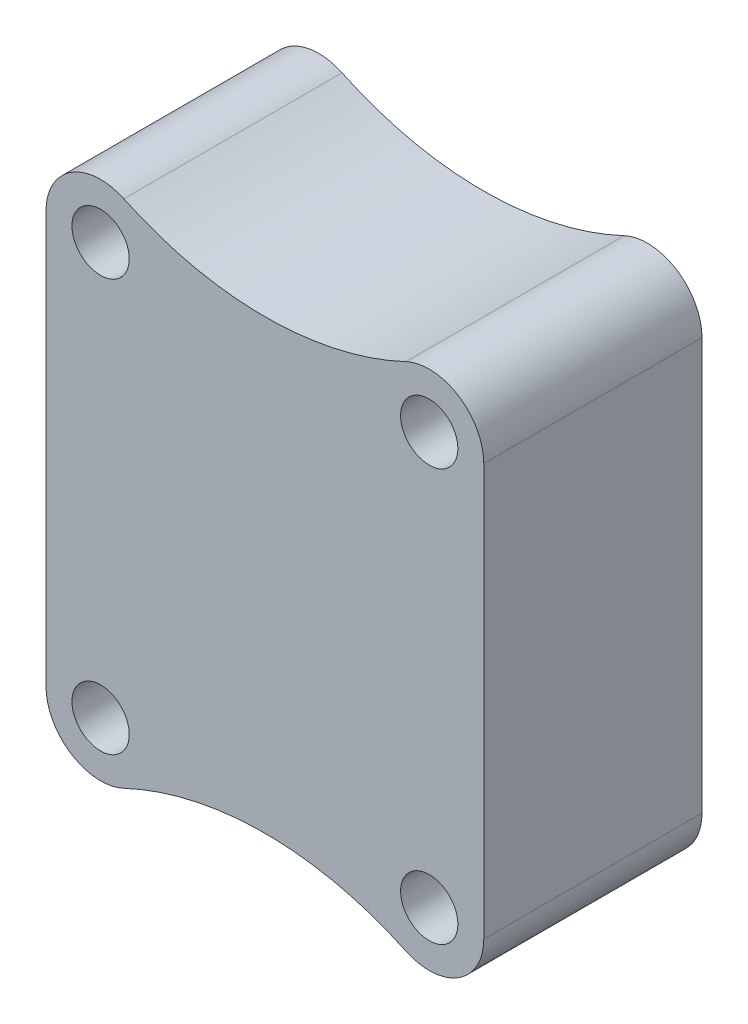
ISO-10303-21;
HEADER;
FILE_DESCRIPTION(('STEP AP214'),'2;1');
FILE_NAME('part.step','',(''),(''),'','','');
FILE_SCHEMA(('AUTOMOTIVE_DESIGN { 1 0 10303 214 1 1 1 1 }'));
ENDSEC;
DATA;
#1=APPLICATION_CONTEXT('core data for automotive mechanical design processes');
#2=APPLICATION_PROTOCOL_DEFINITION('international standard','automotive_design',2000,#1);
#3=PRODUCT_CONTEXT('',#1,'mechanical');
#4=PRODUCT('Part','Part','',(#3));
#5=PRODUCT_RELATED_PRODUCT_CATEGORY('part','',(#4));
#6=PRODUCT_DEFINITION_FORMATION('','',#4);
#7=PRODUCT_DEFINITION_CONTEXT('part definition',#1,'design');
#8=PRODUCT_DEFINITION('design','',#6,#7);
#9=PRODUCT_DEFINITION_SHAPE('','',#8);
#10=(LENGTH_UNIT() NAMED_UNIT(*) SI_UNIT(.MILLI.,.METRE.));
#11=(NAMED_UNIT(*) PLANE_ANGLE_UNIT() SI_UNIT($,.RADIAN.));
#12=(NAMED_UNIT(*) SI_UNIT($,.STERADIAN.) SOLID_ANGLE_UNIT());
#13=UNCERTAINTY_MEASURE_WITH_UNIT(LENGTH_MEASURE(1.E-05),#10,'distance_accuracy_value','');
#14=(GEOMETRIC_REPRESENTATION_CONTEXT(3) GLOBAL_UNCERTAINTY_ASSIGNED_CONTEXT((#13)) GLOBAL_UNIT_ASSIGNED_CONTEXT((#10,
#11,#12)) REPRESENTATION_CONTEXT('',''));
#15=CARTESIAN_POINT('',(0.,0.,0.));
#16=DIRECTION('',(0.,0.,1.));
#17=DIRECTION('',(1.,0.,0.));
#18=AXIS2_PLACEMENT_3D('',#15,#16,#17);
#19=CARTESIAN_POINT('',(12.05,-25.5393518518518,16.));
#20=DIRECTION('',(0.,0.,1.));
#21=DIRECTION('',(1.,0.,0.));
#22=AXIS2_PLACEMENT_3D('',#19,#20,#21);
#23=PLANE('',#22);
#24=CARTESIAN_POINT('',(24.1,30.2,16.));
#25=DIRECTION('',(0.,0.,1.));
#26=DIRECTION('',(1.,0.,0.));
#27=AXIS2_PLACEMENT_3D('',#24,#25,#26);
#28=CIRCLE('',#27,2.1);
#29=CARTESIAN_POINT('',(26.2,30.2,16.));
#30=VERTEX_POINT('',#29);
#31=EDGE_CURVE('E229',#30,#30,#28,.T.);
#32=ORIENTED_EDGE('',*,*,#31,.F.);
#33=EDGE_LOOP('',(#32));
#34=FACE_BOUND('',#33,.T.);
#35=CARTESIAN_POINT('',(0.,0.,16.));
#36=DIRECTION('',(0.,0.,1.));
#37=DIRECTION('',(1.,0.,0.));
#38=AXIS2_PLACEMENT_3D('',#35,#36,#37);
#39=CIRCLE('',#38,2.1);
#40=CARTESIAN_POINT('',(2.1,0.,16.));
#41=VERTEX_POINT('',#40);
#42=EDGE_CURVE('E154',#41,#41,#39,.T.);
#43=ORIENTED_EDGE('',*,*,#42,.F.);
#44=EDGE_LOOP('',(#43));
#45=FACE_BOUND('',#44,.T.);
#46=CARTESIAN_POINT('',(12.05,-25.5393518518518,16.));
#47=DIRECTION('',(0.,0.,-1.));
#48=DIRECTION('',(1.,0.,0.));
#49=AXIS2_PLACEMENT_3D('',#46,#47,#48);
#50=CIRCLE('',#49,24.2393518518518);
#51=CARTESIAN_POINT('',(1.70683804121514,-3.61755496171943,16.));
#52=VERTEX_POINT('',#51);
#53=CARTESIAN_POINT('',(22.3931619587849,-3.61755496171943,16.));
#54=VERTEX_POINT('',#53);
#55=EDGE_CURVE('E172',#52,#54,#50,.T.);
#56=ORIENTED_EDGE('',*,*,#55,.T.);
#57=CARTESIAN_POINT('',(24.1,0.,16.));
#58=DIRECTION('',(0.,0.,1.));
#59=DIRECTION('',(1.,0.,0.));
#60=AXIS2_PLACEMENT_3D('',#57,#58,#59);
#61=CIRCLE('',#60,4.);
#62=CARTESIAN_POINT('',(28.1,0.,16.));
#63=VERTEX_POINT('',#62);
#64=EDGE_CURVE('E108',#54,#63,#61,.T.);
#65=ORIENTED_EDGE('',*,*,#64,.T.);
#66=DIRECTION('',(0.,1.,0.));
#67=VECTOR('',#66,1.);
#68=CARTESIAN_POINT('',(28.1,0.,16.));
#69=LINE('',#68,#67);
#70=CARTESIAN_POINT('',(28.1,30.2,16.));
#71=VERTEX_POINT('',#70);
#72=EDGE_CURVE('E193',#63,#71,#69,.T.);
#73=ORIENTED_EDGE('',*,*,#72,.T.);
#74=CARTESIAN_POINT('',(24.1,30.2,16.));
#75=DIRECTION('',(0.,0.,1.));
#76=DIRECTION('',(-1.,0.,0.));
#77=AXIS2_PLACEMENT_3D('',#74,#75,#76);
#78=CIRCLE('',#77,4.00000000000001);
#79=CARTESIAN_POINT('',(22.3931619587849,33.8175549617194,16.));
#80=VERTEX_POINT('',#79);
#81=EDGE_CURVE('E207',#71,#80,#78,.T.);
#82=ORIENTED_EDGE('',*,*,#81,.T.);
#83=CARTESIAN_POINT('',(12.05,55.7393518518518,16.));
#84=DIRECTION('',(0.,0.,-1.));
#85=DIRECTION('',(-1.,0.,0.));
#86=AXIS2_PLACEMENT_3D('',#83,#84,#85);
#87=CIRCLE('',#86,24.2393518518518);
#88=CARTESIAN_POINT('',(1.70683804121514,33.8175549617194,16.));
#89=VERTEX_POINT('',#88);
#90=EDGE_CURVE('E127',#80,#89,#87,.T.);
#91=ORIENTED_EDGE('',*,*,#90,.T.);
#92=CARTESIAN_POINT('',(0.,30.2,16.));
#93=DIRECTION('',(0.,0.,1.));
#94=DIRECTION('',(-1.,0.,0.));
#95=AXIS2_PLACEMENT_3D('',#92,#93,#94);
#96=CIRCLE('',#95,4.);
#97=CARTESIAN_POINT('',(-4.,30.2,16.));
#98=VERTEX_POINT('',#97);
#99=EDGE_CURVE('E121',#89,#98,#96,.T.);
#100=ORIENTED_EDGE('',*,*,#99,.T.);
#101=DIRECTION('',(0.,-1.,0.));
#102=VECTOR('',#101,1.);
#103=CARTESIAN_POINT('',(-4.,0.,16.));
#104=LINE('',#103,#102);
#105=CARTESIAN_POINT('',(-4.,0.,16.));
#106=VERTEX_POINT('',#105);
#107=EDGE_CURVE('E125',#98,#106,#104,.T.);
#108=ORIENTED_EDGE('',*,*,#107,.T.);
#109=CARTESIAN_POINT('',(0.,0.,16.));
#110=DIRECTION('',(0.,0.,1.));
#111=DIRECTION('',(-1.,0.,0.));
#112=AXIS2_PLACEMENT_3D('',#109,#110,#111);
#113=CIRCLE('',#112,4.);
#114=EDGE_CURVE('E65',#106,#52,#113,.T.);
#115=ORIENTED_EDGE('',*,*,#114,.T.);
#116=EDGE_LOOP('',(#56,#65,#73,#82,#91,#100,#108,#115));
#117=FACE_BOUND('',#116,.T.);
#118=CARTESIAN_POINT('',(0.,30.2,16.));
#119=DIRECTION('',(0.,0.,1.));
#120=DIRECTION('',(1.,0.,0.));
#121=AXIS2_PLACEMENT_3D('',#118,#119,#120);
#122=CIRCLE('',#121,2.1);
#123=CARTESIAN_POINT('',(2.1,30.2,16.));
#124=VERTEX_POINT('',#123);
#125=EDGE_CURVE('E221',#124,#124,#122,.T.);
#126=ORIENTED_EDGE('',*,*,#125,.F.);
#127=EDGE_LOOP('',(#126));
#128=FACE_BOUND('',#127,.T.);
#129=CARTESIAN_POINT('',(24.1,0.,16.));
#130=DIRECTION('',(0.,0.,1.));
#131=DIRECTION('',(1.,0.,0.));
#132=AXIS2_PLACEMENT_3D('',#129,#130,#131);
#133=CIRCLE('',#132,2.1);
#134=CARTESIAN_POINT('',(26.2,0.,16.));
#135=VERTEX_POINT('',#134);
#136=EDGE_CURVE('E237',#135,#135,#133,.T.);
#137=ORIENTED_EDGE('',*,*,#136,.F.);
#138=EDGE_LOOP('',(#137));
#139=FACE_BOUND('',#138,.T.);
#140=ADVANCED_FACE('F47',(#34,#45,#117,#128,#139),#23,.T.);
#141=CARTESIAN_POINT('',(12.05,-25.5393518518518,0.));
#142=DIRECTION('',(0.,0.,1.));
#143=DIRECTION('',(1.,0.,0.));
#144=AXIS2_PLACEMENT_3D('',#141,#142,#143);
#145=PLANE('',#144);
#146=CARTESIAN_POINT('',(12.05,-25.5393518518518,0.));
#147=DIRECTION('',(0.,0.,-1.));
#148=DIRECTION('',(1.,0.,0.));
#149=AXIS2_PLACEMENT_3D('',#146,#147,#148);
#150=CIRCLE('',#149,24.2393518518518);
#151=CARTESIAN_POINT('',(1.70683804121514,-3.61755496171943,0.));
#152=VERTEX_POINT('',#151);
#153=CARTESIAN_POINT('',(22.3931619587849,-3.61755496171943,0.));
#154=VERTEX_POINT('',#153);
#155=EDGE_CURVE('E149',#152,#154,#150,.T.);
#156=ORIENTED_EDGE('',*,*,#155,.F.);
#157=CARTESIAN_POINT('',(0.,0.,0.));
#158=DIRECTION('',(0.,0.,1.));
#159=DIRECTION('',(-1.,0.,0.));
#160=AXIS2_PLACEMENT_3D('',#157,#158,#159);
#161=CIRCLE('',#160,4.);
#162=CARTESIAN_POINT('',(-4.,0.,0.));
#163=VERTEX_POINT('',#162);
#164=EDGE_CURVE('E100',#163,#152,#161,.T.);
#165=ORIENTED_EDGE('',*,*,#164,.F.);
#166=DIRECTION('',(0.,-1.,0.));
#167=VECTOR('',#166,1.);
#168=CARTESIAN_POINT('',(-4.,0.,0.));
#169=LINE('',#168,#167);
#170=CARTESIAN_POINT('',(-4.,30.2,0.));
#171=VERTEX_POINT('',#170);
#172=EDGE_CURVE('E94',#171,#163,#169,.T.);
#173=ORIENTED_EDGE('',*,*,#172,.F.);
#174=CARTESIAN_POINT('',(0.,30.2,0.));
#175=DIRECTION('',(0.,0.,1.));
#176=DIRECTION('',(-1.,0.,0.));
#177=AXIS2_PLACEMENT_3D('',#174,#175,#176);
#178=CIRCLE('',#177,4.);
#179=CARTESIAN_POINT('',(1.70683804121514,33.8175549617194,0.));
#180=VERTEX_POINT('',#179);
#181=EDGE_CURVE('E136',#180,#171,#178,.T.);
#182=ORIENTED_EDGE('',*,*,#181,.F.);
#183=CARTESIAN_POINT('',(12.05,55.7393518518518,0.));
#184=DIRECTION('',(0.,0.,-1.));
#185=DIRECTION('',(-1.,0.,0.));
#186=AXIS2_PLACEMENT_3D('',#183,#184,#185);
#187=CIRCLE('',#186,24.2393518518518);
#188=CARTESIAN_POINT('',(22.3931619587849,33.8175549617194,0.));
#189=VERTEX_POINT('',#188);
#190=EDGE_CURVE('E163',#189,#180,#187,.T.);
#191=ORIENTED_EDGE('',*,*,#190,.F.);
#192=CARTESIAN_POINT('',(24.1,30.2,0.));
#193=DIRECTION('',(0.,0.,1.));
#194=DIRECTION('',(-1.,0.,0.));
#195=AXIS2_PLACEMENT_3D('',#192,#193,#194);
#196=CIRCLE('',#195,4.00000000000001);
#197=CARTESIAN_POINT('',(28.1,30.2,0.));
#198=VERTEX_POINT('',#197);
#199=EDGE_CURVE('E160',#198,#189,#196,.T.);
#200=ORIENTED_EDGE('',*,*,#199,.F.);
#201=DIRECTION('',(0.,1.,0.));
#202=VECTOR('',#201,1.);
#203=CARTESIAN_POINT('',(28.1,0.,0.));
#204=LINE('',#203,#202);
#205=CARTESIAN_POINT('',(28.1,0.,0.));
#206=VERTEX_POINT('',#205);
#207=EDGE_CURVE('E157',#206,#198,#204,.T.);
#208=ORIENTED_EDGE('',*,*,#207,.F.);
#209=CARTESIAN_POINT('',(24.1,0.,0.));
#210=DIRECTION('',(0.,0.,1.));
#211=DIRECTION('',(1.,0.,0.));
#212=AXIS2_PLACEMENT_3D('',#209,#210,#211);
#213=CIRCLE('',#212,4.);
#214=EDGE_CURVE('E153',#154,#206,#213,.T.);
#215=ORIENTED_EDGE('',*,*,#214,.F.);
#216=EDGE_LOOP('',(#156,#165,#173,#182,#191,#200,#208,#215));
#217=FACE_BOUND('',#216,.T.);
#218=CARTESIAN_POINT('',(0.,0.,0.));
#219=DIRECTION('',(0.,0.,1.));
#220=DIRECTION('',(1.,0.,0.));
#221=AXIS2_PLACEMENT_3D('',#218,#219,#220);
#222=CIRCLE('',#221,2.1);
#223=CARTESIAN_POINT('',(2.1,0.,0.));
#224=VERTEX_POINT('',#223);
#225=EDGE_CURVE('E217',#224,#224,#222,.T.);
#226=ORIENTED_EDGE('',*,*,#225,.T.);
#227=EDGE_LOOP('',(#226));
#228=FACE_BOUND('',#227,.T.);
#229=CARTESIAN_POINT('',(0.,30.2,0.));
#230=DIRECTION('',(0.,0.,1.));
#231=DIRECTION('',(1.,0.,0.));
#232=AXIS2_PLACEMENT_3D('',#229,#230,#231);
#233=CIRCLE('',#232,2.1);
#234=CARTESIAN_POINT('',(2.1,30.2,0.));
#235=VERTEX_POINT('',#234);
#236=EDGE_CURVE('E225',#235,#235,#233,.T.);
#237=ORIENTED_EDGE('',*,*,#236,.T.);
#238=EDGE_LOOP('',(#237));
#239=FACE_BOUND('',#238,.T.);
#240=CARTESIAN_POINT('',(24.1,30.2,0.));
#241=DIRECTION('',(0.,0.,1.));
#242=DIRECTION('',(1.,0.,0.));
#243=AXIS2_PLACEMENT_3D('',#240,#241,#242);
#244=CIRCLE('',#243,2.1);
#245=CARTESIAN_POINT('',(26.2,30.2,0.));
#246=VERTEX_POINT('',#245);
#247=EDGE_CURVE('E233',#246,#246,#244,.T.);
#248=ORIENTED_EDGE('',*,*,#247,.T.);
#249=EDGE_LOOP('',(#248));
#250=FACE_BOUND('',#249,.T.);
#251=CARTESIAN_POINT('',(24.1,0.,0.));
#252=DIRECTION('',(0.,0.,1.));
#253=DIRECTION('',(1.,0.,0.));
#254=AXIS2_PLACEMENT_3D('',#251,#252,#253);
#255=CIRCLE('',#254,2.1);
#256=CARTESIAN_POINT('',(26.2,0.,0.));
#257=VERTEX_POINT('',#256);
#258=EDGE_CURVE('E241',#257,#257,#255,.T.);
#259=ORIENTED_EDGE('',*,*,#258,.T.);
#260=EDGE_LOOP('',(#259));
#261=FACE_BOUND('',#260,.T.);
#262=ADVANCED_FACE('F197',(#217,#228,#239,#250,#261),#145,.F.);
#263=CARTESIAN_POINT('',(12.05,-25.5393518518518,16.));
#264=DIRECTION('',(0.,0.,-1.));
#265=DIRECTION('',(-1.,0.,0.));
#266=AXIS2_PLACEMENT_3D('',#263,#264,#265);
#267=CYLINDRICAL_SURFACE('',#266,24.2393518518518);
#268=ORIENTED_EDGE('',*,*,#155,.T.);
#269=DIRECTION('',(0.,0.,-1.));
#270=VECTOR('',#269,1.);
#271=CARTESIAN_POINT('',(22.3931619587849,-3.61755496171943,16.));
#272=LINE('',#271,#270);
#273=EDGE_CURVE('E11',#54,#154,#272,.T.);
#274=ORIENTED_EDGE('',*,*,#273,.F.);
#275=ORIENTED_EDGE('',*,*,#55,.F.);
#276=DIRECTION('',(0.,0.,-1.));
#277=VECTOR('',#276,1.);
#278=CARTESIAN_POINT('',(1.70683804121514,-3.61755496171943,16.));
#279=LINE('',#278,#277);
#280=EDGE_CURVE('E145',#52,#152,#279,.T.);
#281=ORIENTED_EDGE('',*,*,#280,.T.);
#282=EDGE_LOOP('',(#268,#274,#275,#281));
#283=FACE_BOUND('',#282,.T.);
#284=ADVANCED_FACE('F49',(#283),#267,.F.);
#285=CARTESIAN_POINT('',(24.1,0.,16.));
#286=DIRECTION('',(0.,0.,-1.));
#287=DIRECTION('',(-1.,0.,0.));
#288=AXIS2_PLACEMENT_3D('',#285,#286,#287);
#289=CYLINDRICAL_SURFACE('',#288,4.);
#290=ORIENTED_EDGE('',*,*,#214,.T.);
#291=DIRECTION('',(0.,0.,-1.));
#292=VECTOR('',#291,1.);
#293=CARTESIAN_POINT('',(28.1,0.,16.));
#294=LINE('',#293,#292);
#295=EDGE_CURVE('E57',#63,#206,#294,.T.);
#296=ORIENTED_EDGE('',*,*,#295,.F.);
#297=ORIENTED_EDGE('',*,*,#64,.F.);
#298=ORIENTED_EDGE('',*,*,#273,.T.);
#299=EDGE_LOOP('',(#290,#296,#297,#298));
#300=FACE_BOUND('',#299,.T.);
#301=ADVANCED_FACE('F276',(#300),#289,.T.);
#302=CARTESIAN_POINT('',(28.1,0.,16.));
#303=DIRECTION('',(-1.,0.,0.));
#304=DIRECTION('',(0.,-1.,0.));
#305=AXIS2_PLACEMENT_3D('',#302,#303,#304);
#306=PLANE('',#305);
#307=ORIENTED_EDGE('',*,*,#207,.T.);
#308=DIRECTION('',(0.,0.,-1.));
#309=VECTOR('',#308,1.);
#310=CARTESIAN_POINT('',(28.1,30.2,16.));
#311=LINE('',#310,#309);
#312=EDGE_CURVE('E183',#71,#198,#311,.T.);
#313=ORIENTED_EDGE('',*,*,#312,.F.);
#314=ORIENTED_EDGE('',*,*,#72,.F.);
#315=ORIENTED_EDGE('',*,*,#295,.T.);
#316=EDGE_LOOP('',(#307,#313,#314,#315));
#317=FACE_BOUND('',#316,.T.);
#318=ADVANCED_FACE('F191',(#317),#306,.F.);
#319=CARTESIAN_POINT('',(24.1,30.2,16.));
#320=DIRECTION('',(0.,0.,-1.));
#321=DIRECTION('',(-1.,0.,0.));
#322=AXIS2_PLACEMENT_3D('',#319,#320,#321);
#323=CYLINDRICAL_SURFACE('',#322,4.00000000000001);
#324=ORIENTED_EDGE('',*,*,#199,.T.);
#325=DIRECTION('',(0.,0.,-1.));
#326=VECTOR('',#325,1.);
#327=CARTESIAN_POINT('',(22.3931619587849,33.8175549617194,16.));
#328=LINE('',#327,#326);
#329=EDGE_CURVE('E179',#80,#189,#328,.T.);
#330=ORIENTED_EDGE('',*,*,#329,.F.);
#331=ORIENTED_EDGE('',*,*,#81,.F.);
#332=ORIENTED_EDGE('',*,*,#312,.T.);
#333=EDGE_LOOP('',(#324,#330,#331,#332));
#334=FACE_BOUND('',#333,.T.);
#335=ADVANCED_FACE('F202',(#334),#323,.T.);
#336=CARTESIAN_POINT('',(12.05,55.7393518518518,16.));
#337=DIRECTION('',(0.,0.,-1.));
#338=DIRECTION('',(-1.,0.,0.));
#339=AXIS2_PLACEMENT_3D('',#336,#337,#338);
#340=CYLINDRICAL_SURFACE('',#339,24.2393518518518);
#341=ORIENTED_EDGE('',*,*,#190,.T.);
#342=DIRECTION('',(0.,0.,-1.));
#343=VECTOR('',#342,1.);
#344=CARTESIAN_POINT('',(1.70683804121514,33.8175549617194,16.));
#345=LINE('',#344,#343);
#346=EDGE_CURVE('E138',#89,#180,#345,.T.);
#347=ORIENTED_EDGE('',*,*,#346,.F.);
#348=ORIENTED_EDGE('',*,*,#90,.F.);
#349=ORIENTED_EDGE('',*,*,#329,.T.);
#350=EDGE_LOOP('',(#341,#347,#348,#349));
#351=FACE_BOUND('',#350,.T.);
#352=ADVANCED_FACE('F205',(#351),#340,.F.);
#353=CARTESIAN_POINT('',(0.,30.2,16.));
#354=DIRECTION('',(0.,0.,-1.));
#355=DIRECTION('',(-1.,0.,0.));
#356=AXIS2_PLACEMENT_3D('',#353,#354,#355);
#357=CYLINDRICAL_SURFACE('',#356,4.);
#358=ORIENTED_EDGE('',*,*,#181,.T.);
#359=DIRECTION('',(0.,0.,-1.));
#360=VECTOR('',#359,1.);
#361=CARTESIAN_POINT('',(-4.,30.2,16.));
#362=LINE('',#361,#360);
#363=EDGE_CURVE('E133',#98,#171,#362,.T.);
#364=ORIENTED_EDGE('',*,*,#363,.F.);
#365=ORIENTED_EDGE('',*,*,#99,.F.);
#366=ORIENTED_EDGE('',*,*,#346,.T.);
#367=EDGE_LOOP('',(#358,#364,#365,#366));
#368=FACE_BOUND('',#367,.T.);
#369=ADVANCED_FACE('F134',(#368),#357,.T.);
#370=CARTESIAN_POINT('',(-4.,0.,16.));
#371=DIRECTION('',(1.,0.,0.));
#372=DIRECTION('',(0.,1.,0.));
#373=AXIS2_PLACEMENT_3D('',#370,#371,#372);
#374=PLANE('',#373);
#375=ORIENTED_EDGE('',*,*,#172,.T.);
#376=DIRECTION('',(0.,0.,-1.));
#377=VECTOR('',#376,1.);
#378=CARTESIAN_POINT('',(-4.,0.,16.));
#379=LINE('',#378,#377);
#380=EDGE_CURVE('E139',#106,#163,#379,.T.);
#381=ORIENTED_EDGE('',*,*,#380,.F.);
#382=ORIENTED_EDGE('',*,*,#107,.F.);
#383=ORIENTED_EDGE('',*,*,#363,.T.);
#384=EDGE_LOOP('',(#375,#381,#382,#383));
#385=FACE_BOUND('',#384,.T.);
#386=ADVANCED_FACE('F141',(#385),#374,.F.);
#387=CARTESIAN_POINT('',(0.,0.,16.));
#388=DIRECTION('',(0.,0.,-1.));
#389=DIRECTION('',(-1.,0.,0.));
#390=AXIS2_PLACEMENT_3D('',#387,#388,#389);
#391=CYLINDRICAL_SURFACE('',#390,4.);
#392=ORIENTED_EDGE('',*,*,#164,.T.);
#393=ORIENTED_EDGE('',*,*,#280,.F.);
#394=ORIENTED_EDGE('',*,*,#114,.F.);
#395=ORIENTED_EDGE('',*,*,#380,.T.);
#396=EDGE_LOOP('',(#392,#393,#394,#395));
#397=FACE_BOUND('',#396,.T.);
#398=ADVANCED_FACE('F265',(#397),#391,.T.);
#399=CARTESIAN_POINT('',(0.,0.,16.));
#400=DIRECTION('',(0.,0.,-1.));
#401=DIRECTION('',(-1.,0.,0.));
#402=AXIS2_PLACEMENT_3D('',#399,#400,#401);
#403=CYLINDRICAL_SURFACE('',#402,2.1);
#404=ORIENTED_EDGE('',*,*,#42,.T.);
#405=EDGE_LOOP('',(#404));
#406=FACE_BOUND('',#405,.T.);
#407=ORIENTED_EDGE('',*,*,#225,.F.);
#408=EDGE_LOOP('',(#407));
#409=FACE_BOUND('',#408,.T.);
#410=ADVANCED_FACE('F262',(#406,#409),#403,.F.);
#411=CARTESIAN_POINT('',(0.,30.2,16.));
#412=DIRECTION('',(0.,0.,-1.));
#413=DIRECTION('',(-1.,0.,0.));
#414=AXIS2_PLACEMENT_3D('',#411,#412,#413);
#415=CYLINDRICAL_SURFACE('',#414,2.1);
#416=ORIENTED_EDGE('',*,*,#125,.T.);
#417=EDGE_LOOP('',(#416));
#418=FACE_BOUND('',#417,.T.);
#419=ORIENTED_EDGE('',*,*,#236,.F.);
#420=EDGE_LOOP('',(#419));
#421=FACE_BOUND('',#420,.T.);
#422=ADVANCED_FACE('F342',(#418,#421),#415,.F.);
#423=CARTESIAN_POINT('',(24.1,30.2,16.));
#424=DIRECTION('',(0.,0.,-1.));
#425=DIRECTION('',(-1.,0.,0.));
#426=AXIS2_PLACEMENT_3D('',#423,#424,#425);
#427=CYLINDRICAL_SURFACE('',#426,2.1);
#428=ORIENTED_EDGE('',*,*,#31,.T.);
#429=EDGE_LOOP('',(#428));
#430=FACE_BOUND('',#429,.T.);
#431=ORIENTED_EDGE('',*,*,#247,.F.);
#432=EDGE_LOOP('',(#431));
#433=FACE_BOUND('',#432,.T.);
#434=ADVANCED_FACE('F350',(#430,#433),#427,.F.);
#435=CARTESIAN_POINT('',(24.1,0.,16.));
#436=DIRECTION('',(0.,0.,-1.));
#437=DIRECTION('',(-1.,0.,0.));
#438=AXIS2_PLACEMENT_3D('',#435,#436,#437);
#439=CYLINDRICAL_SURFACE('',#438,2.1);
#440=ORIENTED_EDGE('',*,*,#136,.T.);
#441=EDGE_LOOP('',(#440));
#442=FACE_BOUND('',#441,.T.);
#443=ORIENTED_EDGE('',*,*,#258,.F.);
#444=EDGE_LOOP('',(#443));
#445=FACE_BOUND('',#444,.T.);
#446=ADVANCED_FACE('F249',(#442,#445),#439,.F.);
#447=CLOSED_SHELL('',(#140,#262,#284,#301,#318,#335,#352,#369,#386,#398,#410,#422,#434,#446));
#448=MANIFOLD_SOLID_BREP('B2',#447);
#449=ADVANCED_BREP_SHAPE_REPRESENTATION('',(#18,#448),#14);
#450=SHAPE_DEFINITION_REPRESENTATION(#9,#449);
ENDSEC;
END-ISO-10303-21;
